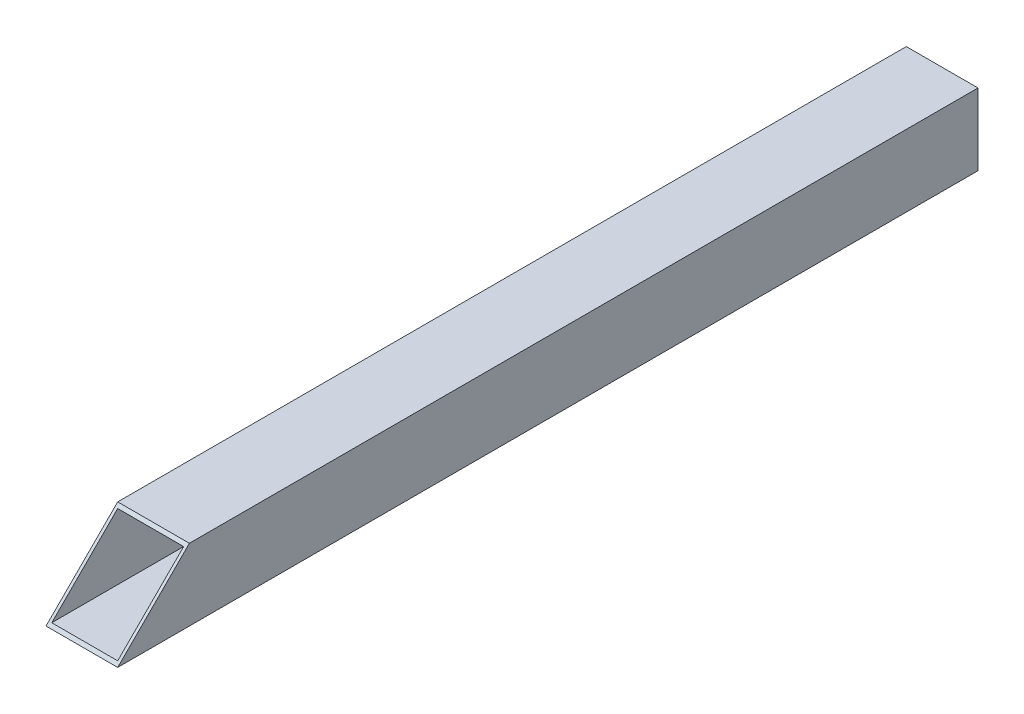
ISO-10303-21;
HEADER;
FILE_DESCRIPTION(('STEP AP214'),'2;1');
FILE_NAME('part.step','',(''),(''),'','','');
FILE_SCHEMA(('AUTOMOTIVE_DESIGN { 1 0 10303 214 1 1 1 1 }'));
ENDSEC;
DATA;
#1=APPLICATION_CONTEXT('core data for automotive mechanical design processes');
#2=APPLICATION_PROTOCOL_DEFINITION('international standard','automotive_design',2000,#1);
#3=PRODUCT_CONTEXT('',#1,'mechanical');
#4=PRODUCT('Part','Part','',(#3));
#5=PRODUCT_RELATED_PRODUCT_CATEGORY('part','',(#4));
#6=PRODUCT_DEFINITION_FORMATION('','',#4);
#7=PRODUCT_DEFINITION_CONTEXT('part definition',#1,'design');
#8=PRODUCT_DEFINITION('design','',#6,#7);
#9=PRODUCT_DEFINITION_SHAPE('','',#8);
#10=(LENGTH_UNIT() NAMED_UNIT(*) SI_UNIT(.MILLI.,.METRE.));
#11=(NAMED_UNIT(*) PLANE_ANGLE_UNIT() SI_UNIT($,.RADIAN.));
#12=(NAMED_UNIT(*) SI_UNIT($,.STERADIAN.) SOLID_ANGLE_UNIT());
#13=UNCERTAINTY_MEASURE_WITH_UNIT(LENGTH_MEASURE(1.E-05),#10,'distance_accuracy_value','');
#14=(GEOMETRIC_REPRESENTATION_CONTEXT(3) GLOBAL_UNCERTAINTY_ASSIGNED_CONTEXT((#13)) GLOBAL_UNIT_ASSIGNED_CONTEXT((#10,
#11,#12)) REPRESENTATION_CONTEXT('',''));
#15=CARTESIAN_POINT('',(0.,0.,0.));
#16=DIRECTION('',(0.,0.,1.));
#17=DIRECTION('',(1.,0.,0.));
#18=AXIS2_PLACEMENT_3D('',#15,#16,#17);
#19=CARTESIAN_POINT('',(0.,0.,0.));
#20=DIRECTION('',(0.,0.,-1.));
#21=DIRECTION('',(-1.,0.,0.));
#22=AXIS2_PLACEMENT_3D('',#19,#20,#21);
#23=PLANE('',#22);
#24=DIRECTION('',(0.,1.,0.));
#25=VECTOR('',#24,1.);
#26=CARTESIAN_POINT('',(12.5,-12.5,0.));
#27=LINE('',#26,#25);
#28=CARTESIAN_POINT('',(12.5,-12.5,0.));
#29=VERTEX_POINT('',#28);
#30=CARTESIAN_POINT('',(12.5,12.5,0.));
#31=VERTEX_POINT('',#30);
#32=EDGE_CURVE('E137',#29,#31,#27,.T.);
#33=ORIENTED_EDGE('',*,*,#32,.F.);
#34=DIRECTION('',(1.,0.,0.));
#35=VECTOR('',#34,1.);
#36=CARTESIAN_POINT('',(-12.5,-12.5,0.));
#37=LINE('',#36,#35);
#38=CARTESIAN_POINT('',(-12.5,-12.5,0.));
#39=VERTEX_POINT('',#38);
#40=EDGE_CURVE('E132',#39,#29,#37,.T.);
#41=ORIENTED_EDGE('',*,*,#40,.F.);
#42=DIRECTION('',(0.,-1.,0.));
#43=VECTOR('',#42,1.);
#44=CARTESIAN_POINT('',(-12.5,-12.5,0.));
#45=LINE('',#44,#43);
#46=CARTESIAN_POINT('',(-12.5,12.5,0.));
#47=VERTEX_POINT('',#46);
#48=EDGE_CURVE('E134',#47,#39,#45,.T.);
#49=ORIENTED_EDGE('',*,*,#48,.F.);
#50=DIRECTION('',(-1.,0.,0.));
#51=VECTOR('',#50,1.);
#52=CARTESIAN_POINT('',(-12.5,12.5,0.));
#53=LINE('',#52,#51);
#54=EDGE_CURVE('E123',#31,#47,#53,.T.);
#55=ORIENTED_EDGE('',*,*,#54,.F.);
#56=EDGE_LOOP('',(#33,#41,#49,#55));
#57=FACE_BOUND('',#56,.T.);
#58=DIRECTION('',(-1.,0.,0.));
#59=VECTOR('',#58,1.);
#60=CARTESIAN_POINT('',(-11.5,11.5,0.));
#61=LINE('',#60,#59);
#62=CARTESIAN_POINT('',(11.5,11.5,0.));
#63=VERTEX_POINT('',#62);
#64=CARTESIAN_POINT('',(-11.5,11.5,0.));
#65=VERTEX_POINT('',#64);
#66=EDGE_CURVE('E148',#63,#65,#61,.T.);
#67=ORIENTED_EDGE('',*,*,#66,.T.);
#68=DIRECTION('',(0.,-1.,0.));
#69=VECTOR('',#68,1.);
#70=CARTESIAN_POINT('',(-11.5,-11.5,0.));
#71=LINE('',#70,#69);
#72=CARTESIAN_POINT('',(-11.5,-11.5,0.));
#73=VERTEX_POINT('',#72);
#74=EDGE_CURVE('E157',#65,#73,#71,.T.);
#75=ORIENTED_EDGE('',*,*,#74,.T.);
#76=DIRECTION('',(1.,0.,0.));
#77=VECTOR('',#76,1.);
#78=CARTESIAN_POINT('',(-11.5,-11.5,0.));
#79=LINE('',#78,#77);
#80=CARTESIAN_POINT('',(11.5,-11.5,0.));
#81=VERTEX_POINT('',#80);
#82=EDGE_CURVE('E154',#73,#81,#79,.T.);
#83=ORIENTED_EDGE('',*,*,#82,.T.);
#84=DIRECTION('',(0.,1.,0.));
#85=VECTOR('',#84,1.);
#86=CARTESIAN_POINT('',(11.5,-11.5,0.));
#87=LINE('',#86,#85);
#88=EDGE_CURVE('E151',#81,#63,#87,.T.);
#89=ORIENTED_EDGE('',*,*,#88,.T.);
#90=EDGE_LOOP('',(#67,#75,#83,#89));
#91=FACE_BOUND('',#90,.T.);
#92=ADVANCED_FACE('F37',(#57,#91),#23,.T.);
#93=CARTESIAN_POINT('',(12.5,-12.5,300.));
#94=DIRECTION('',(-1.,0.,0.));
#95=DIRECTION('',(0.,0.,1.));
#96=AXIS2_PLACEMENT_3D('',#93,#94,#95);
#97=PLANE('',#96);
#98=DIRECTION('',(0.,0.,-1.));
#99=VECTOR('',#98,1.);
#100=CARTESIAN_POINT('',(12.5,12.5,300.));
#101=LINE('',#100,#99);
#102=CARTESIAN_POINT('',(12.5,12.5,275.));
#103=VERTEX_POINT('',#102);
#104=EDGE_CURVE('E45',#103,#31,#101,.T.);
#105=ORIENTED_EDGE('',*,*,#104,.F.);
#106=DIRECTION('',(0.,0.70710678118655,-0.707106781186545));
#107=VECTOR('',#106,1.);
#108=CARTESIAN_POINT('',(12.5,-12.5,300.));
#109=LINE('',#108,#107);
#110=CARTESIAN_POINT('',(12.5,-12.5,300.));
#111=VERTEX_POINT('',#110);
#112=EDGE_CURVE('E107',#111,#103,#109,.T.);
#113=ORIENTED_EDGE('',*,*,#112,.F.);
#114=DIRECTION('',(0.,0.,-1.));
#115=VECTOR('',#114,1.);
#116=CARTESIAN_POINT('',(12.5,-12.5,300.));
#117=LINE('',#116,#115);
#118=EDGE_CURVE('E126',#111,#29,#117,.T.);
#119=ORIENTED_EDGE('',*,*,#118,.T.);
#120=ORIENTED_EDGE('',*,*,#32,.T.);
#121=EDGE_LOOP('',(#105,#113,#119,#120));
#122=FACE_BOUND('',#121,.T.);
#123=ADVANCED_FACE('F39',(#122),#97,.F.);
#124=CARTESIAN_POINT('',(-12.5,12.5,300.));
#125=DIRECTION('',(0.,-1.,0.));
#126=DIRECTION('',(0.,0.,-1.));
#127=AXIS2_PLACEMENT_3D('',#124,#125,#126);
#128=PLANE('',#127);
#129=DIRECTION('',(0.,0.,-1.));
#130=VECTOR('',#129,1.);
#131=CARTESIAN_POINT('',(-12.5,12.5,300.));
#132=LINE('',#131,#130);
#133=CARTESIAN_POINT('',(-12.5,12.5,275.));
#134=VERTEX_POINT('',#133);
#135=EDGE_CURVE('E115',#134,#47,#132,.T.);
#136=ORIENTED_EDGE('',*,*,#135,.F.);
#137=DIRECTION('',(1.,0.,0.));
#138=VECTOR('',#137,1.);
#139=CARTESIAN_POINT('',(-12.5,12.5,275.));
#140=LINE('',#139,#138);
#141=EDGE_CURVE('E101',#134,#103,#140,.T.);
#142=ORIENTED_EDGE('',*,*,#141,.T.);
#143=ORIENTED_EDGE('',*,*,#104,.T.);
#144=ORIENTED_EDGE('',*,*,#54,.T.);
#145=EDGE_LOOP('',(#136,#142,#143,#144));
#146=FACE_BOUND('',#145,.T.);
#147=ADVANCED_FACE('F121',(#146),#128,.F.);
#148=CARTESIAN_POINT('',(-12.5,-12.5,300.));
#149=DIRECTION('',(1.,0.,0.));
#150=DIRECTION('',(0.,0.,-1.));
#151=AXIS2_PLACEMENT_3D('',#148,#149,#150);
#152=PLANE('',#151);
#153=DIRECTION('',(0.,0.,-1.));
#154=VECTOR('',#153,1.);
#155=CARTESIAN_POINT('',(-12.5,-12.5,300.));
#156=LINE('',#155,#154);
#157=CARTESIAN_POINT('',(-12.5,-12.5,300.));
#158=VERTEX_POINT('',#157);
#159=EDGE_CURVE('E118',#158,#39,#156,.T.);
#160=ORIENTED_EDGE('',*,*,#159,.F.);
#161=DIRECTION('',(0.,0.70710678118655,-0.707106781186545));
#162=VECTOR('',#161,1.);
#163=CARTESIAN_POINT('',(-12.5,-12.5,300.));
#164=LINE('',#163,#162);
#165=EDGE_CURVE('E104',#158,#134,#164,.T.);
#166=ORIENTED_EDGE('',*,*,#165,.T.);
#167=ORIENTED_EDGE('',*,*,#135,.T.);
#168=ORIENTED_EDGE('',*,*,#48,.T.);
#169=EDGE_LOOP('',(#160,#166,#167,#168));
#170=FACE_BOUND('',#169,.T.);
#171=ADVANCED_FACE('F114',(#170),#152,.F.);
#172=CARTESIAN_POINT('',(-12.5,-12.5,300.));
#173=DIRECTION('',(0.,1.,0.));
#174=DIRECTION('',(0.,0.,1.));
#175=AXIS2_PLACEMENT_3D('',#172,#173,#174);
#176=PLANE('',#175);
#177=ORIENTED_EDGE('',*,*,#40,.T.);
#178=ORIENTED_EDGE('',*,*,#118,.F.);
#179=DIRECTION('',(1.,0.,0.));
#180=VECTOR('',#179,1.);
#181=CARTESIAN_POINT('',(-12.5,-12.5,300.));
#182=LINE('',#181,#180);
#183=EDGE_CURVE('E131',#158,#111,#182,.T.);
#184=ORIENTED_EDGE('',*,*,#183,.F.);
#185=ORIENTED_EDGE('',*,*,#159,.T.);
#186=EDGE_LOOP('',(#177,#178,#184,#185));
#187=FACE_BOUND('',#186,.T.);
#188=ADVANCED_FACE('F179',(#187),#176,.F.);
#189=CARTESIAN_POINT('',(-11.5,-11.5,300.));
#190=DIRECTION('',(1.,0.,0.));
#191=DIRECTION('',(0.,0.,-1.));
#192=AXIS2_PLACEMENT_3D('',#189,#190,#191);
#193=PLANE('',#192);
#194=DIRECTION('',(0.,0.70710678118655,-0.707106781186545));
#195=VECTOR('',#194,1.);
#196=CARTESIAN_POINT('',(-11.5,-12.,299.5));
#197=LINE('',#196,#195);
#198=CARTESIAN_POINT('',(-11.5,-11.5,299.));
#199=VERTEX_POINT('',#198);
#200=CARTESIAN_POINT('',(-11.5,11.5,276.));
#201=VERTEX_POINT('',#200);
#202=EDGE_CURVE('E51',#199,#201,#197,.T.);
#203=ORIENTED_EDGE('',*,*,#202,.F.);
#204=DIRECTION('',(0.,0.,-1.));
#205=VECTOR('',#204,1.);
#206=CARTESIAN_POINT('',(-11.5,-11.5,300.));
#207=LINE('',#206,#205);
#208=EDGE_CURVE('E140',#199,#73,#207,.T.);
#209=ORIENTED_EDGE('',*,*,#208,.T.);
#210=ORIENTED_EDGE('',*,*,#74,.F.);
#211=DIRECTION('',(0.,0.,-1.));
#212=VECTOR('',#211,1.);
#213=CARTESIAN_POINT('',(-11.5,11.5,300.));
#214=LINE('',#213,#212);
#215=EDGE_CURVE('E58',#201,#65,#214,.T.);
#216=ORIENTED_EDGE('',*,*,#215,.F.);
#217=EDGE_LOOP('',(#203,#209,#210,#216));
#218=FACE_BOUND('',#217,.T.);
#219=ADVANCED_FACE('F177',(#218),#193,.T.);
#220=CARTESIAN_POINT('',(-11.5,-11.5,300.));
#221=DIRECTION('',(0.,1.,0.));
#222=DIRECTION('',(0.,0.,1.));
#223=AXIS2_PLACEMENT_3D('',#220,#221,#222);
#224=PLANE('',#223);
#225=DIRECTION('',(-1.,0.,0.));
#226=VECTOR('',#225,1.);
#227=CARTESIAN_POINT('',(-11.5,-11.5,299.));
#228=LINE('',#227,#226);
#229=CARTESIAN_POINT('',(11.5,-11.5,299.));
#230=VERTEX_POINT('',#229);
#231=EDGE_CURVE('E161',#230,#199,#228,.T.);
#232=ORIENTED_EDGE('',*,*,#231,.F.);
#233=DIRECTION('',(0.,0.,-1.));
#234=VECTOR('',#233,1.);
#235=CARTESIAN_POINT('',(11.5,-11.5,300.));
#236=LINE('',#235,#234);
#237=EDGE_CURVE('E143',#230,#81,#236,.T.);
#238=ORIENTED_EDGE('',*,*,#237,.T.);
#239=ORIENTED_EDGE('',*,*,#82,.F.);
#240=ORIENTED_EDGE('',*,*,#208,.F.);
#241=EDGE_LOOP('',(#232,#238,#239,#240));
#242=FACE_BOUND('',#241,.T.);
#243=ADVANCED_FACE('F171',(#242),#224,.T.);
#244=CARTESIAN_POINT('',(11.5,-11.5,300.));
#245=DIRECTION('',(-1.,0.,0.));
#246=DIRECTION('',(0.,-1.,0.));
#247=AXIS2_PLACEMENT_3D('',#244,#245,#246);
#248=PLANE('',#247);
#249=DIRECTION('',(0.,-0.70710678118655,0.707106781186545));
#250=VECTOR('',#249,1.);
#251=CARTESIAN_POINT('',(11.5,-12.,299.5));
#252=LINE('',#251,#250);
#253=CARTESIAN_POINT('',(11.5,11.5,276.));
#254=VERTEX_POINT('',#253);
#255=EDGE_CURVE('E111',#254,#230,#252,.T.);
#256=ORIENTED_EDGE('',*,*,#255,.F.);
#257=DIRECTION('',(0.,0.,-1.));
#258=VECTOR('',#257,1.);
#259=CARTESIAN_POINT('',(11.5,11.5,300.));
#260=LINE('',#259,#258);
#261=EDGE_CURVE('E145',#254,#63,#260,.T.);
#262=ORIENTED_EDGE('',*,*,#261,.T.);
#263=ORIENTED_EDGE('',*,*,#88,.F.);
#264=ORIENTED_EDGE('',*,*,#237,.F.);
#265=EDGE_LOOP('',(#256,#262,#263,#264));
#266=FACE_BOUND('',#265,.T.);
#267=ADVANCED_FACE('F174',(#266),#248,.T.);
#268=CARTESIAN_POINT('',(-11.5,11.5,300.));
#269=DIRECTION('',(0.,-1.,0.));
#270=DIRECTION('',(1.,0.,0.));
#271=AXIS2_PLACEMENT_3D('',#268,#269,#270);
#272=PLANE('',#271);
#273=DIRECTION('',(1.,0.,0.));
#274=VECTOR('',#273,1.);
#275=CARTESIAN_POINT('',(-11.5,11.5,276.));
#276=LINE('',#275,#274);
#277=EDGE_CURVE('E11',#201,#254,#276,.T.);
#278=ORIENTED_EDGE('',*,*,#277,.F.);
#279=ORIENTED_EDGE('',*,*,#215,.T.);
#280=ORIENTED_EDGE('',*,*,#66,.F.);
#281=ORIENTED_EDGE('',*,*,#261,.F.);
#282=EDGE_LOOP('',(#278,#279,#280,#281));
#283=FACE_BOUND('',#282,.T.);
#284=ADVANCED_FACE('F233',(#283),#272,.T.);
#285=CARTESIAN_POINT('',(-12.5,-12.5,300.));
#286=DIRECTION('',(0.,-0.707106781186545,-0.70710678118655));
#287=DIRECTION('',(0.,0.70710678118655,-0.707106781186545));
#288=AXIS2_PLACEMENT_3D('',#285,#286,#287);
#289=PLANE('',#288);
#290=ORIENTED_EDGE('',*,*,#202,.T.);
#291=ORIENTED_EDGE('',*,*,#277,.T.);
#292=ORIENTED_EDGE('',*,*,#255,.T.);
#293=ORIENTED_EDGE('',*,*,#231,.T.);
#294=EDGE_LOOP('',(#290,#291,#292,#293));
#295=FACE_BOUND('',#294,.T.);
#296=ORIENTED_EDGE('',*,*,#112,.T.);
#297=ORIENTED_EDGE('',*,*,#141,.F.);
#298=ORIENTED_EDGE('',*,*,#165,.F.);
#299=ORIENTED_EDGE('',*,*,#183,.T.);
#300=EDGE_LOOP('',(#296,#297,#298,#299));
#301=FACE_BOUND('',#300,.T.);
#302=ADVANCED_FACE('F103',(#295,#301),#289,.F.);
#303=CLOSED_SHELL('',(#92,#123,#147,#171,#188,#219,#243,#267,#284,#302));
#304=MANIFOLD_SOLID_BREP('B2',#303);
#305=ADVANCED_BREP_SHAPE_REPRESENTATION('',(#18,#304),#14);
#306=SHAPE_DEFINITION_REPRESENTATION(#9,#305);
ENDSEC;
END-ISO-10303-21;
